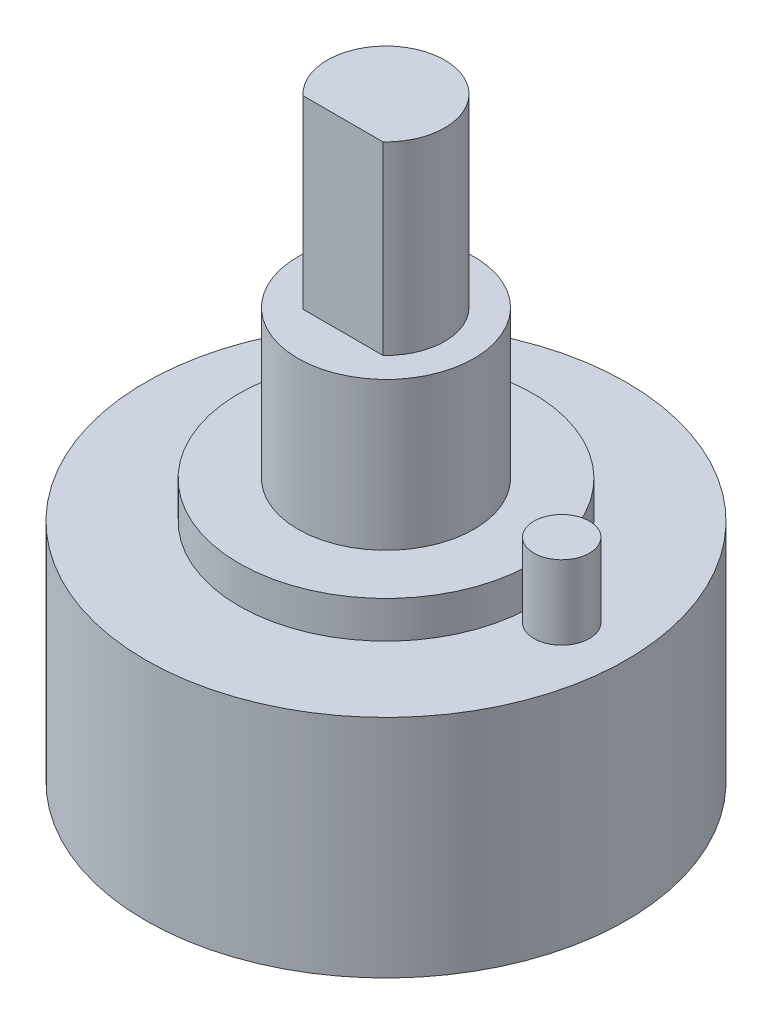
ISO-10303-21;
HEADER;
FILE_DESCRIPTION(('STEP AP214'),'2;1');
FILE_NAME('part.step','',(''),(''),'','','');
FILE_SCHEMA(('AUTOMOTIVE_DESIGN { 1 0 10303 214 1 1 1 1 }'));
ENDSEC;
DATA;
#1=APPLICATION_CONTEXT('core data for automotive mechanical design processes');
#2=APPLICATION_PROTOCOL_DEFINITION('international standard','automotive_design',2000,#1);
#3=PRODUCT_CONTEXT('',#1,'mechanical');
#4=PRODUCT('Part','Part','',(#3));
#5=PRODUCT_RELATED_PRODUCT_CATEGORY('part','',(#4));
#6=PRODUCT_DEFINITION_FORMATION('','',#4);
#7=PRODUCT_DEFINITION_CONTEXT('part definition',#1,'design');
#8=PRODUCT_DEFINITION('design','',#6,#7);
#9=PRODUCT_DEFINITION_SHAPE('','',#8);
#10=(LENGTH_UNIT() NAMED_UNIT(*) SI_UNIT(.MILLI.,.METRE.));
#11=(NAMED_UNIT(*) PLANE_ANGLE_UNIT() SI_UNIT($,.RADIAN.));
#12=(NAMED_UNIT(*) SI_UNIT($,.STERADIAN.) SOLID_ANGLE_UNIT());
#13=UNCERTAINTY_MEASURE_WITH_UNIT(LENGTH_MEASURE(1.E-05),#10,'distance_accuracy_value','');
#14=(GEOMETRIC_REPRESENTATION_CONTEXT(3) GLOBAL_UNCERTAINTY_ASSIGNED_CONTEXT((#13)) GLOBAL_UNIT_ASSIGNED_CONTEXT((#10,
#11,#12)) REPRESENTATION_CONTEXT('',''));
#15=CARTESIAN_POINT('',(0.,0.,0.));
#16=DIRECTION('',(0.,0.,1.));
#17=DIRECTION('',(1.,0.,0.));
#18=AXIS2_PLACEMENT_3D('',#15,#16,#17);
#19=CARTESIAN_POINT('',(0.,0.,0.));
#20=DIRECTION('',(0.,-1.,0.));
#21=DIRECTION('',(0.,0.,-1.));
#22=AXIS2_PLACEMENT_3D('',#19,#20,#21);
#23=PLANE('',#22);
#24=CARTESIAN_POINT('',(-10.6251840891798,0.,2.84700949612766));
#25=DIRECTION('',(0.,-1.,0.));
#26=DIRECTION('',(0.,0.,-1.));
#27=AXIS2_PLACEMENT_3D('',#24,#25,#26);
#28=CIRCLE('',#27,0.500000000000001);
#29=CARTESIAN_POINT('',(-10.6251840891798,0.,2.34700949612766));
#30=VERTEX_POINT('',#29);
#31=EDGE_CURVE('E199',#30,#30,#28,.T.);
#32=ORIENTED_EDGE('',*,*,#31,.F.);
#33=EDGE_LOOP('',(#32));
#34=FACE_BOUND('',#33,.T.);
#35=CARTESIAN_POINT('',(-10.6251840891798,0.,-2.84700949612766));
#36=DIRECTION('',(0.,-1.,0.));
#37=DIRECTION('',(0.,0.,-1.));
#38=AXIS2_PLACEMENT_3D('',#35,#36,#37);
#39=CIRCLE('',#38,0.500000000000001);
#40=CARTESIAN_POINT('',(-10.6251840891798,0.,-3.34700949612766));
#41=VERTEX_POINT('',#40);
#42=EDGE_CURVE('E198',#41,#41,#39,.T.);
#43=ORIENTED_EDGE('',*,*,#42,.F.);
#44=EDGE_LOOP('',(#43));
#45=FACE_BOUND('',#44,.T.);
#46=CARTESIAN_POINT('',(-2.8284271247462,0.,-2.82842712474618));
#47=DIRECTION('',(0.,-1.,0.));
#48=DIRECTION('',(0.,0.,-1.));
#49=AXIS2_PLACEMENT_3D('',#46,#47,#48);
#50=CIRCLE('',#49,0.5);
#51=CARTESIAN_POINT('',(-2.8284271247462,0.,-3.32842712474618));
#52=VERTEX_POINT('',#51);
#53=EDGE_CURVE('E211',#52,#52,#50,.T.);
#54=ORIENTED_EDGE('',*,*,#53,.F.);
#55=EDGE_LOOP('',(#54));
#56=FACE_BOUND('',#55,.T.);
#57=CARTESIAN_POINT('',(-7.77817459305206,0.,-7.77817459305198));
#58=DIRECTION('',(0.,-1.,0.));
#59=DIRECTION('',(0.,0.,-1.));
#60=AXIS2_PLACEMENT_3D('',#57,#58,#59);
#61=CIRCLE('',#60,0.5);
#62=CARTESIAN_POINT('',(-7.77817459305206,0.,-8.27817459305198));
#63=VERTEX_POINT('',#62);
#64=EDGE_CURVE('E217',#63,#63,#61,.T.);
#65=ORIENTED_EDGE('',*,*,#64,.F.);
#66=EDGE_LOOP('',(#65));
#67=FACE_BOUND('',#66,.T.);
#68=CARTESIAN_POINT('',(-2.84700949612773,0.,-10.6251840891797));
#69=DIRECTION('',(0.,-1.,0.));
#70=DIRECTION('',(0.,0.,-1.));
#71=AXIS2_PLACEMENT_3D('',#68,#69,#70);
#72=CIRCLE('',#71,0.5);
#73=CARTESIAN_POINT('',(-2.84700949612773,0.,-11.1251840891798));
#74=VERTEX_POINT('',#73);
#75=EDGE_CURVE('E225',#74,#74,#72,.T.);
#76=ORIENTED_EDGE('',*,*,#75,.F.);
#77=EDGE_LOOP('',(#76));
#78=FACE_BOUND('',#77,.T.);
#79=CARTESIAN_POINT('',(0.,0.,0.));
#80=DIRECTION('',(0.,1.,0.));
#81=DIRECTION('',(0.,0.,1.));
#82=AXIS2_PLACEMENT_3D('',#79,#80,#81);
#83=CIRCLE('',#82,13.);
#84=CARTESIAN_POINT('',(0.,0.,13.));
#85=VERTEX_POINT('',#84);
#86=EDGE_CURVE('E11',#85,#85,#83,.T.);
#87=ORIENTED_EDGE('',*,*,#86,.F.);
#88=EDGE_LOOP('',(#87));
#89=FACE_BOUND('',#88,.T.);
#90=ADVANCED_FACE('F39',(#34,#45,#56,#67,#78,#89),#23,.T.);
#91=CARTESIAN_POINT('',(0.,0.,0.));
#92=DIRECTION('',(0.,1.,0.));
#93=DIRECTION('',(0.,0.,1.));
#94=AXIS2_PLACEMENT_3D('',#91,#92,#93);
#95=CYLINDRICAL_SURFACE('',#94,13.);
#96=ORIENTED_EDGE('',*,*,#86,.T.);
#97=EDGE_LOOP('',(#96));
#98=FACE_BOUND('',#97,.T.);
#99=CARTESIAN_POINT('',(0.,12.2,0.));
#100=DIRECTION('',(0.,1.,0.));
#101=DIRECTION('',(0.,0.,1.));
#102=AXIS2_PLACEMENT_3D('',#99,#100,#101);
#103=CIRCLE('',#102,13.);
#104=CARTESIAN_POINT('',(0.,12.2,13.));
#105=VERTEX_POINT('',#104);
#106=EDGE_CURVE('E47',#105,#105,#103,.T.);
#107=ORIENTED_EDGE('',*,*,#106,.F.);
#108=EDGE_LOOP('',(#107));
#109=FACE_BOUND('',#108,.T.);
#110=ADVANCED_FACE('F112',(#98,#109),#95,.T.);
#111=CARTESIAN_POINT('',(0.,12.2,13.));
#112=DIRECTION('',(0.,1.,0.));
#113=DIRECTION('',(0.,0.,1.));
#114=AXIS2_PLACEMENT_3D('',#111,#112,#113);
#115=PLANE('',#114);
#116=CARTESIAN_POINT('',(9.5,12.2,0.));
#117=DIRECTION('',(0.,1.,0.));
#118=DIRECTION('',(0.,0.,1.));
#119=AXIS2_PLACEMENT_3D('',#116,#117,#118);
#120=CIRCLE('',#119,1.5);
#121=CARTESIAN_POINT('',(9.5,12.2,1.5));
#122=VERTEX_POINT('',#121);
#123=EDGE_CURVE('E233',#122,#122,#120,.T.);
#124=ORIENTED_EDGE('',*,*,#123,.F.);
#125=EDGE_LOOP('',(#124));
#126=FACE_BOUND('',#125,.T.);
#127=ORIENTED_EDGE('',*,*,#106,.T.);
#128=EDGE_LOOP('',(#127));
#129=FACE_BOUND('',#128,.T.);
#130=CARTESIAN_POINT('',(0.,12.2,0.));
#131=DIRECTION('',(0.,1.,0.));
#132=DIRECTION('',(0.,0.,1.));
#133=AXIS2_PLACEMENT_3D('',#130,#131,#132);
#134=CIRCLE('',#133,7.95);
#135=CARTESIAN_POINT('',(0.,12.2,7.95));
#136=VERTEX_POINT('',#135);
#137=EDGE_CURVE('E102',#136,#136,#134,.T.);
#138=ORIENTED_EDGE('',*,*,#137,.F.);
#139=EDGE_LOOP('',(#138));
#140=FACE_BOUND('',#139,.T.);
#141=ADVANCED_FACE('F109',(#126,#129,#140),#115,.T.);
#142=CARTESIAN_POINT('',(0.,0.,0.));
#143=DIRECTION('',(0.,1.,0.));
#144=DIRECTION('',(0.,0.,1.));
#145=AXIS2_PLACEMENT_3D('',#142,#143,#144);
#146=CYLINDRICAL_SURFACE('',#145,7.95);
#147=ORIENTED_EDGE('',*,*,#137,.T.);
#148=EDGE_LOOP('',(#147));
#149=FACE_BOUND('',#148,.T.);
#150=CARTESIAN_POINT('',(0.,14.2,0.));
#151=DIRECTION('',(0.,1.,0.));
#152=DIRECTION('',(0.,0.,1.));
#153=AXIS2_PLACEMENT_3D('',#150,#151,#152);
#154=CIRCLE('',#153,7.95);
#155=CARTESIAN_POINT('',(0.,14.2,7.95));
#156=VERTEX_POINT('',#155);
#157=EDGE_CURVE('E98',#156,#156,#154,.T.);
#158=ORIENTED_EDGE('',*,*,#157,.F.);
#159=EDGE_LOOP('',(#158));
#160=FACE_BOUND('',#159,.T.);
#161=ADVANCED_FACE('F119',(#149,#160),#146,.T.);
#162=CARTESIAN_POINT('',(0.,14.2,7.95));
#163=DIRECTION('',(0.,1.,0.));
#164=DIRECTION('',(0.,0.,1.));
#165=AXIS2_PLACEMENT_3D('',#162,#163,#164);
#166=PLANE('',#165);
#167=ORIENTED_EDGE('',*,*,#157,.T.);
#168=EDGE_LOOP('',(#167));
#169=FACE_BOUND('',#168,.T.);
#170=CARTESIAN_POINT('',(0.,14.2,0.));
#171=DIRECTION('',(0.,1.,0.));
#172=DIRECTION('',(0.,0.,1.));
#173=AXIS2_PLACEMENT_3D('',#170,#171,#172);
#174=CIRCLE('',#173,4.7625);
#175=CARTESIAN_POINT('',(0.,14.2,4.7625));
#176=VERTEX_POINT('',#175);
#177=EDGE_CURVE('E94',#176,#176,#174,.T.);
#178=ORIENTED_EDGE('',*,*,#177,.F.);
#179=EDGE_LOOP('',(#178));
#180=FACE_BOUND('',#179,.T.);
#181=ADVANCED_FACE('F126',(#169,#180),#166,.T.);
#182=CARTESIAN_POINT('',(0.,0.,0.));
#183=DIRECTION('',(0.,1.,0.));
#184=DIRECTION('',(0.,0.,1.));
#185=AXIS2_PLACEMENT_3D('',#182,#183,#184);
#186=CYLINDRICAL_SURFACE('',#185,4.7625);
#187=ORIENTED_EDGE('',*,*,#177,.T.);
#188=EDGE_LOOP('',(#187));
#189=FACE_BOUND('',#188,.T.);
#190=CARTESIAN_POINT('',(0.,22.2,0.));
#191=DIRECTION('',(0.,1.,0.));
#192=DIRECTION('',(0.,0.,1.));
#193=AXIS2_PLACEMENT_3D('',#190,#191,#192);
#194=CIRCLE('',#193,4.7625);
#195=CARTESIAN_POINT('',(0.,22.2,4.7625));
#196=VERTEX_POINT('',#195);
#197=EDGE_CURVE('E86',#196,#196,#194,.T.);
#198=ORIENTED_EDGE('',*,*,#197,.F.);
#199=EDGE_LOOP('',(#198));
#200=FACE_BOUND('',#199,.T.);
#201=ADVANCED_FACE('F130',(#189,#200),#186,.T.);
#202=CARTESIAN_POINT('',(0.,22.2,4.7625));
#203=DIRECTION('',(0.,1.,0.));
#204=DIRECTION('',(0.,0.,1.));
#205=AXIS2_PLACEMENT_3D('',#202,#203,#204);
#206=PLANE('',#205);
#207=ORIENTED_EDGE('',*,*,#197,.T.);
#208=EDGE_LOOP('',(#207));
#209=FACE_BOUND('',#208,.T.);
#210=CARTESIAN_POINT('',(0.,22.2,0.));
#211=DIRECTION('',(0.,1.,0.));
#212=DIRECTION('',(0.,0.,1.));
#213=AXIS2_PLACEMENT_3D('',#210,#211,#212);
#214=CIRCLE('',#213,3.175);
#215=CARTESIAN_POINT('',(2.16217483104396,22.2,2.325));
#216=VERTEX_POINT('',#215);
#217=CARTESIAN_POINT('',(-2.16217483104396,22.2,2.325));
#218=VERTEX_POINT('',#217);
#219=EDGE_CURVE('E78',#216,#218,#214,.T.);
#220=ORIENTED_EDGE('',*,*,#219,.F.);
#221=DIRECTION('',(1.,0.,0.));
#222=VECTOR('',#221,1.);
#223=CARTESIAN_POINT('',(-2.16217483104396,22.2,2.325));
#224=LINE('',#223,#222);
#225=EDGE_CURVE('E59',#218,#216,#224,.T.);
#226=ORIENTED_EDGE('',*,*,#225,.F.);
#227=EDGE_LOOP('',(#220,#226));
#228=FACE_BOUND('',#227,.T.);
#229=ADVANCED_FACE('F134',(#209,#228),#206,.T.);
#230=CARTESIAN_POINT('',(0.,0.,0.));
#231=DIRECTION('',(0.,1.,0.));
#232=DIRECTION('',(0.,0.,1.));
#233=AXIS2_PLACEMENT_3D('',#230,#231,#232);
#234=CYLINDRICAL_SURFACE('',#233,3.175);
#235=DIRECTION('',(0.,1.,0.));
#236=VECTOR('',#235,1.);
#237=CARTESIAN_POINT('',(-2.16217483104396,17.7929034501159,2.325));
#238=LINE('',#237,#236);
#239=CARTESIAN_POINT('',(-2.16217483104396,32.2,2.325));
#240=VERTEX_POINT('',#239);
#241=EDGE_CURVE('E66',#218,#240,#238,.T.);
#242=ORIENTED_EDGE('',*,*,#241,.T.);
#243=CARTESIAN_POINT('',(0.,32.2,0.));
#244=DIRECTION('',(0.,1.,0.));
#245=DIRECTION('',(0.,0.,1.));
#246=AXIS2_PLACEMENT_3D('',#243,#244,#245);
#247=CIRCLE('',#246,3.175);
#248=CARTESIAN_POINT('',(2.16217483104396,32.2,2.325));
#249=VERTEX_POINT('',#248);
#250=EDGE_CURVE('E76',#249,#240,#247,.T.);
#251=ORIENTED_EDGE('',*,*,#250,.F.);
#252=DIRECTION('',(0.,1.,0.));
#253=VECTOR('',#252,1.);
#254=CARTESIAN_POINT('',(2.16217483104396,17.7929034501159,2.325));
#255=LINE('',#254,#253);
#256=EDGE_CURVE('E54',#216,#249,#255,.T.);
#257=ORIENTED_EDGE('',*,*,#256,.F.);
#258=ORIENTED_EDGE('',*,*,#219,.T.);
#259=EDGE_LOOP('',(#242,#251,#257,#258));
#260=FACE_BOUND('',#259,.T.);
#261=ADVANCED_FACE('F75',(#260),#234,.T.);
#262=CARTESIAN_POINT('',(0.,32.2,3.175));
#263=DIRECTION('',(0.,1.,0.));
#264=DIRECTION('',(0.,0.,1.));
#265=AXIS2_PLACEMENT_3D('',#262,#263,#264);
#266=PLANE('',#265);
#267=DIRECTION('',(-1.,0.,0.));
#268=VECTOR('',#267,1.);
#269=CARTESIAN_POINT('',(-2.16217483104396,32.2,2.325));
#270=LINE('',#269,#268);
#271=EDGE_CURVE('E63',#249,#240,#270,.T.);
#272=ORIENTED_EDGE('',*,*,#271,.F.);
#273=ORIENTED_EDGE('',*,*,#250,.T.);
#274=EDGE_LOOP('',(#272,#273));
#275=FACE_BOUND('',#274,.T.);
#276=ADVANCED_FACE('F81',(#275),#266,.T.);
#277=CARTESIAN_POINT('',(-2.16217483104396,17.7929034501159,2.325));
#278=DIRECTION('',(0.,0.,-1.));
#279=DIRECTION('',(0.,1.,0.));
#280=AXIS2_PLACEMENT_3D('',#277,#278,#279);
#281=PLANE('',#280);
#282=ORIENTED_EDGE('',*,*,#225,.T.);
#283=ORIENTED_EDGE('',*,*,#256,.T.);
#284=ORIENTED_EDGE('',*,*,#271,.T.);
#285=ORIENTED_EDGE('',*,*,#241,.F.);
#286=EDGE_LOOP('',(#282,#283,#284,#285));
#287=FACE_BOUND('',#286,.T.);
#288=ADVANCED_FACE('F65',(#287),#281,.F.);
#289=CARTESIAN_POINT('',(9.5,16.2,0.));
#290=DIRECTION('',(0.,-1.,0.));
#291=DIRECTION('',(0.,0.,-1.));
#292=AXIS2_PLACEMENT_3D('',#289,#290,#291);
#293=CYLINDRICAL_SURFACE('',#292,1.5);
#294=CARTESIAN_POINT('',(9.5,16.2,0.));
#295=DIRECTION('',(0.,1.,0.));
#296=DIRECTION('',(0.,0.,1.));
#297=AXIS2_PLACEMENT_3D('',#294,#295,#296);
#298=CIRCLE('',#297,1.5);
#299=CARTESIAN_POINT('',(9.5,16.2,1.5));
#300=VERTEX_POINT('',#299);
#301=EDGE_CURVE('E71',#300,#300,#298,.T.);
#302=ORIENTED_EDGE('',*,*,#301,.F.);
#303=EDGE_LOOP('',(#302));
#304=FACE_BOUND('',#303,.T.);
#305=ORIENTED_EDGE('',*,*,#123,.T.);
#306=EDGE_LOOP('',(#305));
#307=FACE_BOUND('',#306,.T.);
#308=ADVANCED_FACE('F145',(#304,#307),#293,.T.);
#309=CARTESIAN_POINT('',(9.5,16.2,0.));
#310=DIRECTION('',(0.,1.,0.));
#311=DIRECTION('',(0.,0.,1.));
#312=AXIS2_PLACEMENT_3D('',#309,#310,#311);
#313=PLANE('',#312);
#314=ORIENTED_EDGE('',*,*,#301,.T.);
#315=EDGE_LOOP('',(#314));
#316=FACE_BOUND('',#315,.T.);
#317=ADVANCED_FACE('F148',(#316),#313,.T.);
#318=CARTESIAN_POINT('',(-2.84700949612773,-6.3,-10.6251840891797));
#319=DIRECTION('',(0.,1.,0.));
#320=DIRECTION('',(0.,0.,1.));
#321=AXIS2_PLACEMENT_3D('',#318,#319,#320);
#322=CYLINDRICAL_SURFACE('',#321,0.5);
#323=CARTESIAN_POINT('',(-2.84700949612773,-6.3,-10.6251840891797));
#324=DIRECTION('',(0.,-1.,0.));
#325=DIRECTION('',(0.,0.,-1.));
#326=AXIS2_PLACEMENT_3D('',#323,#324,#325);
#327=CIRCLE('',#326,0.5);
#328=CARTESIAN_POINT('',(-2.84700949612773,-6.3,-11.1251840891798));
#329=VERTEX_POINT('',#328);
#330=EDGE_CURVE('E229',#329,#329,#327,.T.);
#331=ORIENTED_EDGE('',*,*,#330,.F.);
#332=EDGE_LOOP('',(#331));
#333=FACE_BOUND('',#332,.T.);
#334=ORIENTED_EDGE('',*,*,#75,.T.);
#335=EDGE_LOOP('',(#334));
#336=FACE_BOUND('',#335,.T.);
#337=ADVANCED_FACE('F152',(#333,#336),#322,.T.);
#338=CARTESIAN_POINT('',(-2.84700949612773,-6.3,-10.6251840891797));
#339=DIRECTION('',(0.,-1.,0.));
#340=DIRECTION('',(0.,0.,-1.));
#341=AXIS2_PLACEMENT_3D('',#338,#339,#340);
#342=PLANE('',#341);
#343=ORIENTED_EDGE('',*,*,#330,.T.);
#344=EDGE_LOOP('',(#343));
#345=FACE_BOUND('',#344,.T.);
#346=ADVANCED_FACE('F156',(#345),#342,.T.);
#347=CARTESIAN_POINT('',(-7.77817459305206,-6.3,-7.77817459305198));
#348=DIRECTION('',(0.,1.,0.));
#349=DIRECTION('',(0.,0.,1.));
#350=AXIS2_PLACEMENT_3D('',#347,#348,#349);
#351=CYLINDRICAL_SURFACE('',#350,0.5);
#352=CARTESIAN_POINT('',(-7.77817459305206,-6.3,-7.77817459305198));
#353=DIRECTION('',(0.,-1.,0.));
#354=DIRECTION('',(0.,0.,-1.));
#355=AXIS2_PLACEMENT_3D('',#352,#353,#354);
#356=CIRCLE('',#355,0.5);
#357=CARTESIAN_POINT('',(-7.77817459305206,-6.3,-8.27817459305198));
#358=VERTEX_POINT('',#357);
#359=EDGE_CURVE('E221',#358,#358,#356,.T.);
#360=ORIENTED_EDGE('',*,*,#359,.F.);
#361=EDGE_LOOP('',(#360));
#362=FACE_BOUND('',#361,.T.);
#363=ORIENTED_EDGE('',*,*,#64,.T.);
#364=EDGE_LOOP('',(#363));
#365=FACE_BOUND('',#364,.T.);
#366=ADVANCED_FACE('F160',(#362,#365),#351,.T.);
#367=CARTESIAN_POINT('',(-7.77817459305206,-6.3,-7.77817459305198));
#368=DIRECTION('',(0.,-1.,0.));
#369=DIRECTION('',(0.,0.,-1.));
#370=AXIS2_PLACEMENT_3D('',#367,#368,#369);
#371=PLANE('',#370);
#372=ORIENTED_EDGE('',*,*,#359,.T.);
#373=EDGE_LOOP('',(#372));
#374=FACE_BOUND('',#373,.T.);
#375=ADVANCED_FACE('F164',(#374),#371,.T.);
#376=CARTESIAN_POINT('',(-2.8284271247462,-6.3,-2.82842712474618));
#377=DIRECTION('',(0.,1.,0.));
#378=DIRECTION('',(0.,0.,1.));
#379=AXIS2_PLACEMENT_3D('',#376,#377,#378);
#380=CYLINDRICAL_SURFACE('',#379,0.5);
#381=CARTESIAN_POINT('',(-2.8284271247462,-6.3,-2.82842712474618));
#382=DIRECTION('',(0.,-1.,0.));
#383=DIRECTION('',(0.,0.,-1.));
#384=AXIS2_PLACEMENT_3D('',#381,#382,#383);
#385=CIRCLE('',#384,0.5);
#386=CARTESIAN_POINT('',(-2.8284271247462,-6.3,-3.32842712474618));
#387=VERTEX_POINT('',#386);
#388=EDGE_CURVE('E213',#387,#387,#385,.T.);
#389=ORIENTED_EDGE('',*,*,#388,.F.);
#390=EDGE_LOOP('',(#389));
#391=FACE_BOUND('',#390,.T.);
#392=ORIENTED_EDGE('',*,*,#53,.T.);
#393=EDGE_LOOP('',(#392));
#394=FACE_BOUND('',#393,.T.);
#395=ADVANCED_FACE('F168',(#391,#394),#380,.T.);
#396=CARTESIAN_POINT('',(-2.8284271247462,-6.3,-2.82842712474618));
#397=DIRECTION('',(0.,-1.,0.));
#398=DIRECTION('',(0.,0.,-1.));
#399=AXIS2_PLACEMENT_3D('',#396,#397,#398);
#400=PLANE('',#399);
#401=ORIENTED_EDGE('',*,*,#388,.T.);
#402=EDGE_LOOP('',(#401));
#403=FACE_BOUND('',#402,.T.);
#404=ADVANCED_FACE('F172',(#403),#400,.T.);
#405=CARTESIAN_POINT('',(-10.6251840891798,-6.3,-2.84700949612766));
#406=DIRECTION('',(0.,1.,0.));
#407=DIRECTION('',(0.,0.,1.));
#408=AXIS2_PLACEMENT_3D('',#405,#406,#407);
#409=CYLINDRICAL_SURFACE('',#408,0.500000000000001);
#410=CARTESIAN_POINT('',(-10.6251840891798,-6.3,-2.84700949612766));
#411=DIRECTION('',(0.,-1.,0.));
#412=DIRECTION('',(0.,0.,-1.));
#413=AXIS2_PLACEMENT_3D('',#410,#411,#412);
#414=CIRCLE('',#413,0.500000000000001);
#415=CARTESIAN_POINT('',(-10.6251840891798,-6.3,-3.34700949612766));
#416=VERTEX_POINT('',#415);
#417=EDGE_CURVE('E204',#416,#416,#414,.T.);
#418=ORIENTED_EDGE('',*,*,#417,.F.);
#419=EDGE_LOOP('',(#418));
#420=FACE_BOUND('',#419,.T.);
#421=ORIENTED_EDGE('',*,*,#42,.T.);
#422=EDGE_LOOP('',(#421));
#423=FACE_BOUND('',#422,.T.);
#424=ADVANCED_FACE('F176',(#420,#423),#409,.T.);
#425=CARTESIAN_POINT('',(-10.6251840891798,-6.3,-2.84700949612766));
#426=DIRECTION('',(0.,-1.,0.));
#427=DIRECTION('',(0.,0.,-1.));
#428=AXIS2_PLACEMENT_3D('',#425,#426,#427);
#429=PLANE('',#428);
#430=ORIENTED_EDGE('',*,*,#417,.T.);
#431=EDGE_LOOP('',(#430));
#432=FACE_BOUND('',#431,.T.);
#433=ADVANCED_FACE('F180',(#432),#429,.T.);
#434=CARTESIAN_POINT('',(-10.6251840891798,-6.3,2.84700949612766));
#435=DIRECTION('',(0.,1.,0.));
#436=DIRECTION('',(0.,0.,1.));
#437=AXIS2_PLACEMENT_3D('',#434,#435,#436);
#438=CYLINDRICAL_SURFACE('',#437,0.500000000000001);
#439=CARTESIAN_POINT('',(-10.6251840891798,-6.3,2.84700949612766));
#440=DIRECTION('',(0.,-1.,0.));
#441=DIRECTION('',(0.,0.,-1.));
#442=AXIS2_PLACEMENT_3D('',#439,#440,#441);
#443=CIRCLE('',#442,0.500000000000001);
#444=CARTESIAN_POINT('',(-10.6251840891798,-6.3,2.34700949612766));
#445=VERTEX_POINT('',#444);
#446=EDGE_CURVE('E196',#445,#445,#443,.T.);
#447=ORIENTED_EDGE('',*,*,#446,.F.);
#448=EDGE_LOOP('',(#447));
#449=FACE_BOUND('',#448,.T.);
#450=ORIENTED_EDGE('',*,*,#31,.T.);
#451=EDGE_LOOP('',(#450));
#452=FACE_BOUND('',#451,.T.);
#453=ADVANCED_FACE('F184',(#449,#452),#438,.T.);
#454=CARTESIAN_POINT('',(-10.6251840891798,-6.3,2.84700949612766));
#455=DIRECTION('',(0.,-1.,0.));
#456=DIRECTION('',(0.,0.,-1.));
#457=AXIS2_PLACEMENT_3D('',#454,#455,#456);
#458=PLANE('',#457);
#459=ORIENTED_EDGE('',*,*,#446,.T.);
#460=EDGE_LOOP('',(#459));
#461=FACE_BOUND('',#460,.T.);
#462=ADVANCED_FACE('F188',(#461),#458,.T.);
#463=CLOSED_SHELL('',(#90,#110,#141,#161,#181,#201,#229,#261,#276,#288,#308,#317,#337,#346,#366,
#375,#395,#404,#424,#433,#453,#462));
#464=MANIFOLD_SOLID_BREP('B2',#463);
#465=ADVANCED_BREP_SHAPE_REPRESENTATION('',(#18,#464),#14);
#466=SHAPE_DEFINITION_REPRESENTATION(#9,#465);
ENDSEC;
END-ISO-10303-21;
